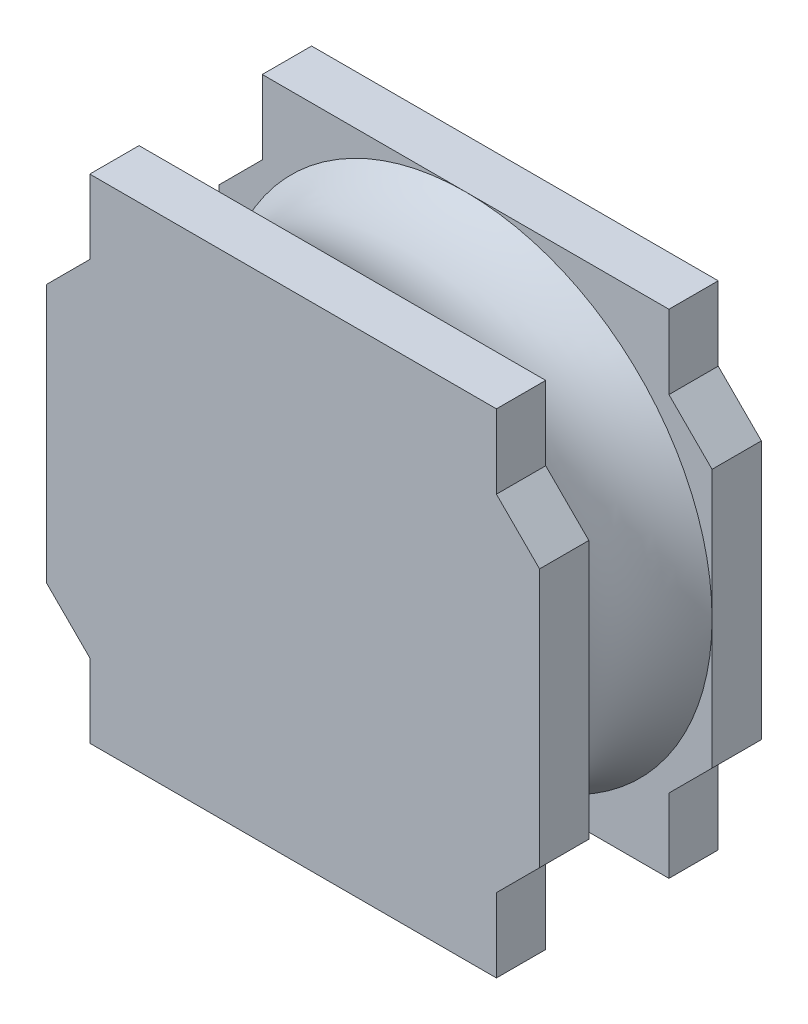
ISO-10303-21;
HEADER;
FILE_DESCRIPTION(('STEP AP214'),'2;1');
FILE_NAME('part.step','',(''),(''),'','','');
FILE_SCHEMA(('AUTOMOTIVE_DESIGN { 1 0 10303 214 1 1 1 1 }'));
ENDSEC;
DATA;
#1=APPLICATION_CONTEXT('core data for automotive mechanical design processes');
#2=APPLICATION_PROTOCOL_DEFINITION('international standard','automotive_design',2000,#1);
#3=PRODUCT_CONTEXT('',#1,'mechanical');
#4=PRODUCT('Part','Part','',(#3));
#5=PRODUCT_RELATED_PRODUCT_CATEGORY('part','',(#4));
#6=PRODUCT_DEFINITION_FORMATION('','',#4);
#7=PRODUCT_DEFINITION_CONTEXT('part definition',#1,'design');
#8=PRODUCT_DEFINITION('design','',#6,#7);
#9=PRODUCT_DEFINITION_SHAPE('','',#8);
#10=(LENGTH_UNIT() NAMED_UNIT(*) SI_UNIT(.MILLI.,.METRE.));
#11=(NAMED_UNIT(*) PLANE_ANGLE_UNIT() SI_UNIT($,.RADIAN.));
#12=(NAMED_UNIT(*) SI_UNIT($,.STERADIAN.) SOLID_ANGLE_UNIT());
#13=UNCERTAINTY_MEASURE_WITH_UNIT(LENGTH_MEASURE(1.E-05),#10,'distance_accuracy_value','');
#14=(GEOMETRIC_REPRESENTATION_CONTEXT(3) GLOBAL_UNCERTAINTY_ASSIGNED_CONTEXT((#13)) GLOBAL_UNIT_ASSIGNED_CONTEXT((#10,
#11,#12)) REPRESENTATION_CONTEXT('',''));
#15=CARTESIAN_POINT('',(0.,0.,0.));
#16=DIRECTION('',(0.,0.,1.));
#17=DIRECTION('',(1.,0.,0.));
#18=AXIS2_PLACEMENT_3D('',#15,#16,#17);
#19=CARTESIAN_POINT('',(-1.65,1.4,1.8));
#20=DIRECTION('',(0.707106781186547,-0.707106781186548,0.));
#21=DIRECTION('',(0.707106781186548,0.707106781186547,0.));
#22=AXIS2_PLACEMENT_3D('',#19,#20,#21);
#23=PLANE('',#22);
#24=DIRECTION('',(-0.707106781186548,-0.707106781186547,0.));
#25=VECTOR('',#24,1.);
#26=CARTESIAN_POINT('',(-1.65,1.4,0.400000000000001));
#27=LINE('',#26,#25);
#28=CARTESIAN_POINT('',(-1.65,1.4,0.400000000000001));
#29=VERTEX_POINT('',#28);
#30=CARTESIAN_POINT('',(-2.,1.05,0.400000000000001));
#31=VERTEX_POINT('',#30);
#32=EDGE_CURVE('E293',#29,#31,#27,.T.);
#33=ORIENTED_EDGE('',*,*,#32,.F.);
#34=DIRECTION('',(0.,0.,-1.));
#35=VECTOR('',#34,1.);
#36=CARTESIAN_POINT('',(-1.65,1.4,1.8));
#37=LINE('',#36,#35);
#38=CARTESIAN_POINT('',(-1.65,1.4,0.));
#39=VERTEX_POINT('',#38);
#40=EDGE_CURVE('E322',#29,#39,#37,.T.);
#41=ORIENTED_EDGE('',*,*,#40,.T.);
#42=DIRECTION('',(-0.707106781186548,-0.707106781186547,0.));
#43=VECTOR('',#42,1.);
#44=CARTESIAN_POINT('',(-1.65,1.4,0.));
#45=LINE('',#44,#43);
#46=CARTESIAN_POINT('',(-2.,1.05,0.));
#47=VERTEX_POINT('',#46);
#48=EDGE_CURVE('E295',#39,#47,#45,.T.);
#49=ORIENTED_EDGE('',*,*,#48,.T.);
#50=DIRECTION('',(0.,0.,-1.));
#51=VECTOR('',#50,1.);
#52=CARTESIAN_POINT('',(-2.,1.05,1.8));
#53=LINE('',#52,#51);
#54=EDGE_CURVE('E399',#31,#47,#53,.T.);
#55=ORIENTED_EDGE('',*,*,#54,.F.);
#56=EDGE_LOOP('',(#33,#41,#49,#55));
#57=FACE_BOUND('',#56,.T.);
#58=ADVANCED_FACE('F35',(#57),#23,.F.);
#59=CARTESIAN_POINT('',(-2.,1.05,1.8));
#60=DIRECTION('',(1.,0.,0.));
#61=DIRECTION('',(0.,0.,-1.));
#62=AXIS2_PLACEMENT_3D('',#59,#60,#61);
#63=PLANE('',#62);
#64=DIRECTION('',(0.,-1.,0.));
#65=VECTOR('',#64,1.);
#66=CARTESIAN_POINT('',(-2.,1.05,0.400000000000001));
#67=LINE('',#66,#65);
#68=CARTESIAN_POINT('',(-2.,0.,0.4));
#69=VERTEX_POINT('',#68);
#70=EDGE_CURVE('E292',#31,#69,#67,.T.);
#71=ORIENTED_EDGE('',*,*,#70,.F.);
#72=ORIENTED_EDGE('',*,*,#54,.T.);
#73=DIRECTION('',(0.,-1.,0.));
#74=VECTOR('',#73,1.);
#75=CARTESIAN_POINT('',(-2.,1.05,0.));
#76=LINE('',#75,#74);
#77=CARTESIAN_POINT('',(-2.,-1.05,0.));
#78=VERTEX_POINT('',#77);
#79=EDGE_CURVE('E325',#47,#78,#76,.T.);
#80=ORIENTED_EDGE('',*,*,#79,.T.);
#81=DIRECTION('',(0.,0.,-1.));
#82=VECTOR('',#81,1.);
#83=CARTESIAN_POINT('',(-2.,-1.05,1.8));
#84=LINE('',#83,#82);
#85=CARTESIAN_POINT('',(-2.,-1.05,0.400000000000001));
#86=VERTEX_POINT('',#85);
#87=EDGE_CURVE('E396',#86,#78,#84,.T.);
#88=ORIENTED_EDGE('',*,*,#87,.F.);
#89=EDGE_CURVE('E290',#69,#86,#67,.T.);
#90=ORIENTED_EDGE('',*,*,#89,.F.);
#91=EDGE_LOOP('',(#71,#72,#80,#88,#90));
#92=FACE_BOUND('',#91,.T.);
#93=ADVANCED_FACE('F491',(#92),#63,.F.);
#94=CARTESIAN_POINT('',(-1.65,-1.4,1.8));
#95=DIRECTION('',(0.707106781186547,0.707106781186548,0.));
#96=DIRECTION('',(-0.707106781186548,0.707106781186547,0.));
#97=AXIS2_PLACEMENT_3D('',#94,#95,#96);
#98=PLANE('',#97);
#99=DIRECTION('',(0.707106781186548,-0.707106781186547,0.));
#100=VECTOR('',#99,1.);
#101=CARTESIAN_POINT('',(-1.65,-1.4,0.400000000000001));
#102=LINE('',#101,#100);
#103=CARTESIAN_POINT('',(-1.65,-1.4,0.400000000000001));
#104=VERTEX_POINT('',#103);
#105=EDGE_CURVE('E288',#86,#104,#102,.T.);
#106=ORIENTED_EDGE('',*,*,#105,.F.);
#107=ORIENTED_EDGE('',*,*,#87,.T.);
#108=DIRECTION('',(0.707106781186548,-0.707106781186547,0.));
#109=VECTOR('',#108,1.);
#110=CARTESIAN_POINT('',(-1.65,-1.4,0.));
#111=LINE('',#110,#109);
#112=CARTESIAN_POINT('',(-1.65,-1.4,0.));
#113=VERTEX_POINT('',#112);
#114=EDGE_CURVE('E328',#78,#113,#111,.T.);
#115=ORIENTED_EDGE('',*,*,#114,.T.);
#116=DIRECTION('',(0.,0.,-1.));
#117=VECTOR('',#116,1.);
#118=CARTESIAN_POINT('',(-1.65,-1.4,1.8));
#119=LINE('',#118,#117);
#120=EDGE_CURVE('E392',#104,#113,#119,.T.);
#121=ORIENTED_EDGE('',*,*,#120,.F.);
#122=EDGE_LOOP('',(#106,#107,#115,#121));
#123=FACE_BOUND('',#122,.T.);
#124=ADVANCED_FACE('F487',(#123),#98,.F.);
#125=CARTESIAN_POINT('',(-1.65,-2.,1.8));
#126=DIRECTION('',(1.,0.,0.));
#127=DIRECTION('',(0.,1.,0.));
#128=AXIS2_PLACEMENT_3D('',#125,#126,#127);
#129=PLANE('',#128);
#130=DIRECTION('',(0.,-1.,0.));
#131=VECTOR('',#130,1.);
#132=CARTESIAN_POINT('',(-1.65,-2.,0.400000000000001));
#133=LINE('',#132,#131);
#134=CARTESIAN_POINT('',(-1.65,-2.,0.400000000000001));
#135=VERTEX_POINT('',#134);
#136=EDGE_CURVE('E286',#104,#135,#133,.T.);
#137=ORIENTED_EDGE('',*,*,#136,.F.);
#138=ORIENTED_EDGE('',*,*,#120,.T.);
#139=DIRECTION('',(0.,-1.,0.));
#140=VECTOR('',#139,1.);
#141=CARTESIAN_POINT('',(-1.65,-2.,0.));
#142=LINE('',#141,#140);
#143=CARTESIAN_POINT('',(-1.65,-2.,0.));
#144=VERTEX_POINT('',#143);
#145=EDGE_CURVE('E331',#113,#144,#142,.T.);
#146=ORIENTED_EDGE('',*,*,#145,.T.);
#147=DIRECTION('',(0.,0.,-1.));
#148=VECTOR('',#147,1.);
#149=CARTESIAN_POINT('',(-1.65,-2.,1.8));
#150=LINE('',#149,#148);
#151=EDGE_CURVE('E388',#135,#144,#150,.T.);
#152=ORIENTED_EDGE('',*,*,#151,.F.);
#153=EDGE_LOOP('',(#137,#138,#146,#152));
#154=FACE_BOUND('',#153,.T.);
#155=ADVANCED_FACE('F482',(#154),#129,.F.);
#156=CARTESIAN_POINT('',(-1.65,-2.,1.8));
#157=DIRECTION('',(0.,1.,0.));
#158=DIRECTION('',(0.,0.,1.));
#159=AXIS2_PLACEMENT_3D('',#156,#157,#158);
#160=PLANE('',#159);
#161=DIRECTION('',(1.,0.,0.));
#162=VECTOR('',#161,1.);
#163=CARTESIAN_POINT('',(-1.65,-2.,0.400000000000001));
#164=LINE('',#163,#162);
#165=CARTESIAN_POINT('',(0.,-2.,0.4));
#166=VERTEX_POINT('',#165);
#167=EDGE_CURVE('E285',#135,#166,#164,.T.);
#168=ORIENTED_EDGE('',*,*,#167,.F.);
#169=ORIENTED_EDGE('',*,*,#151,.T.);
#170=DIRECTION('',(1.,0.,0.));
#171=VECTOR('',#170,1.);
#172=CARTESIAN_POINT('',(-1.65,-2.,0.));
#173=LINE('',#172,#171);
#174=CARTESIAN_POINT('',(1.65,-2.,0.));
#175=VERTEX_POINT('',#174);
#176=EDGE_CURVE('E334',#144,#175,#173,.T.);
#177=ORIENTED_EDGE('',*,*,#176,.T.);
#178=DIRECTION('',(0.,0.,-1.));
#179=VECTOR('',#178,1.);
#180=CARTESIAN_POINT('',(1.65,-2.,1.8));
#181=LINE('',#180,#179);
#182=CARTESIAN_POINT('',(1.65,-2.,0.4));
#183=VERTEX_POINT('',#182);
#184=EDGE_CURVE('E384',#183,#175,#181,.T.);
#185=ORIENTED_EDGE('',*,*,#184,.F.);
#186=EDGE_CURVE('E283',#166,#183,#164,.T.);
#187=ORIENTED_EDGE('',*,*,#186,.F.);
#188=EDGE_LOOP('',(#168,#169,#177,#185,#187));
#189=FACE_BOUND('',#188,.T.);
#190=ADVANCED_FACE('F477',(#189),#160,.F.);
#191=CARTESIAN_POINT('',(1.65,-2.,1.8));
#192=DIRECTION('',(-1.,0.,0.));
#193=DIRECTION('',(0.,-1.,0.));
#194=AXIS2_PLACEMENT_3D('',#191,#192,#193);
#195=PLANE('',#194);
#196=DIRECTION('',(0.,1.,0.));
#197=VECTOR('',#196,1.);
#198=CARTESIAN_POINT('',(1.65,-2.,0.4));
#199=LINE('',#198,#197);
#200=CARTESIAN_POINT('',(1.65,-1.4,0.4));
#201=VERTEX_POINT('',#200);
#202=EDGE_CURVE('E281',#183,#201,#199,.T.);
#203=ORIENTED_EDGE('',*,*,#202,.F.);
#204=ORIENTED_EDGE('',*,*,#184,.T.);
#205=DIRECTION('',(0.,1.,0.));
#206=VECTOR('',#205,1.);
#207=CARTESIAN_POINT('',(1.65,-2.,0.));
#208=LINE('',#207,#206);
#209=CARTESIAN_POINT('',(1.65,-1.4,0.));
#210=VERTEX_POINT('',#209);
#211=EDGE_CURVE('E337',#175,#210,#208,.T.);
#212=ORIENTED_EDGE('',*,*,#211,.T.);
#213=DIRECTION('',(0.,0.,-1.));
#214=VECTOR('',#213,1.);
#215=CARTESIAN_POINT('',(1.65,-1.4,1.8));
#216=LINE('',#215,#214);
#217=EDGE_CURVE('E380',#201,#210,#216,.T.);
#218=ORIENTED_EDGE('',*,*,#217,.F.);
#219=EDGE_LOOP('',(#203,#204,#212,#218));
#220=FACE_BOUND('',#219,.T.);
#221=ADVANCED_FACE('F472',(#220),#195,.F.);
#222=CARTESIAN_POINT('',(1.65,-1.4,1.8));
#223=DIRECTION('',(-0.707106781186547,0.707106781186548,0.));
#224=DIRECTION('',(-0.707106781186548,-0.707106781186547,0.));
#225=AXIS2_PLACEMENT_3D('',#222,#223,#224);
#226=PLANE('',#225);
#227=DIRECTION('',(0.707106781186548,0.707106781186547,0.));
#228=VECTOR('',#227,1.);
#229=CARTESIAN_POINT('',(1.65,-1.4,0.4));
#230=LINE('',#229,#228);
#231=CARTESIAN_POINT('',(2.,-1.05,0.4));
#232=VERTEX_POINT('',#231);
#233=EDGE_CURVE('E279',#201,#232,#230,.T.);
#234=ORIENTED_EDGE('',*,*,#233,.F.);
#235=ORIENTED_EDGE('',*,*,#217,.T.);
#236=DIRECTION('',(0.707106781186548,0.707106781186547,0.));
#237=VECTOR('',#236,1.);
#238=CARTESIAN_POINT('',(1.65,-1.4,0.));
#239=LINE('',#238,#237);
#240=CARTESIAN_POINT('',(2.,-1.05,0.));
#241=VERTEX_POINT('',#240);
#242=EDGE_CURVE('E340',#210,#241,#239,.T.);
#243=ORIENTED_EDGE('',*,*,#242,.T.);
#244=DIRECTION('',(0.,0.,-1.));
#245=VECTOR('',#244,1.);
#246=CARTESIAN_POINT('',(2.,-1.05,1.8));
#247=LINE('',#246,#245);
#248=EDGE_CURVE('E376',#232,#241,#247,.T.);
#249=ORIENTED_EDGE('',*,*,#248,.F.);
#250=EDGE_LOOP('',(#234,#235,#243,#249));
#251=FACE_BOUND('',#250,.T.);
#252=ADVANCED_FACE('F467',(#251),#226,.F.);
#253=CARTESIAN_POINT('',(2.,1.05,1.8));
#254=DIRECTION('',(-1.,0.,0.));
#255=DIRECTION('',(0.,0.,1.));
#256=AXIS2_PLACEMENT_3D('',#253,#254,#255);
#257=PLANE('',#256);
#258=DIRECTION('',(0.,1.,0.));
#259=VECTOR('',#258,1.);
#260=CARTESIAN_POINT('',(2.,1.05,0.4));
#261=LINE('',#260,#259);
#262=CARTESIAN_POINT('',(2.,0.,0.4));
#263=VERTEX_POINT('',#262);
#264=EDGE_CURVE('E278',#232,#263,#261,.T.);
#265=ORIENTED_EDGE('',*,*,#264,.F.);
#266=ORIENTED_EDGE('',*,*,#248,.T.);
#267=DIRECTION('',(0.,1.,0.));
#268=VECTOR('',#267,1.);
#269=CARTESIAN_POINT('',(2.,1.05,0.));
#270=LINE('',#269,#268);
#271=CARTESIAN_POINT('',(2.,1.05,0.));
#272=VERTEX_POINT('',#271);
#273=EDGE_CURVE('E343',#241,#272,#270,.T.);
#274=ORIENTED_EDGE('',*,*,#273,.T.);
#275=DIRECTION('',(0.,0.,-1.));
#276=VECTOR('',#275,1.);
#277=CARTESIAN_POINT('',(2.,1.05,1.8));
#278=LINE('',#277,#276);
#279=CARTESIAN_POINT('',(2.,1.05,0.4));
#280=VERTEX_POINT('',#279);
#281=EDGE_CURVE('E372',#280,#272,#278,.T.);
#282=ORIENTED_EDGE('',*,*,#281,.F.);
#283=EDGE_CURVE('E276',#263,#280,#261,.T.);
#284=ORIENTED_EDGE('',*,*,#283,.F.);
#285=EDGE_LOOP('',(#265,#266,#274,#282,#284));
#286=FACE_BOUND('',#285,.T.);
#287=ADVANCED_FACE('F462',(#286),#257,.F.);
#288=CARTESIAN_POINT('',(1.65,1.4,1.8));
#289=DIRECTION('',(-0.707106781186547,-0.707106781186548,0.));
#290=DIRECTION('',(0.707106781186548,-0.707106781186547,0.));
#291=AXIS2_PLACEMENT_3D('',#288,#289,#290);
#292=PLANE('',#291);
#293=DIRECTION('',(-0.707106781186548,0.707106781186547,0.));
#294=VECTOR('',#293,1.);
#295=CARTESIAN_POINT('',(1.65,1.4,0.4));
#296=LINE('',#295,#294);
#297=CARTESIAN_POINT('',(1.65,1.4,0.4));
#298=VERTEX_POINT('',#297);
#299=EDGE_CURVE('E274',#280,#298,#296,.T.);
#300=ORIENTED_EDGE('',*,*,#299,.F.);
#301=ORIENTED_EDGE('',*,*,#281,.T.);
#302=DIRECTION('',(-0.707106781186548,0.707106781186547,0.));
#303=VECTOR('',#302,1.);
#304=CARTESIAN_POINT('',(1.65,1.4,0.));
#305=LINE('',#304,#303);
#306=CARTESIAN_POINT('',(1.65,1.4,0.));
#307=VERTEX_POINT('',#306);
#308=EDGE_CURVE('E346',#272,#307,#305,.T.);
#309=ORIENTED_EDGE('',*,*,#308,.T.);
#310=DIRECTION('',(0.,0.,-1.));
#311=VECTOR('',#310,1.);
#312=CARTESIAN_POINT('',(1.65,1.4,1.8));
#313=LINE('',#312,#311);
#314=EDGE_CURVE('E368',#298,#307,#313,.T.);
#315=ORIENTED_EDGE('',*,*,#314,.F.);
#316=EDGE_LOOP('',(#300,#301,#309,#315));
#317=FACE_BOUND('',#316,.T.);
#318=ADVANCED_FACE('F458',(#317),#292,.F.);
#319=CARTESIAN_POINT('',(1.65,2.,1.8));
#320=DIRECTION('',(-1.,0.,0.));
#321=DIRECTION('',(0.,-1.,0.));
#322=AXIS2_PLACEMENT_3D('',#319,#320,#321);
#323=PLANE('',#322);
#324=DIRECTION('',(0.,1.,0.));
#325=VECTOR('',#324,1.);
#326=CARTESIAN_POINT('',(1.65,2.,0.4));
#327=LINE('',#326,#325);
#328=CARTESIAN_POINT('',(1.65,2.,0.4));
#329=VERTEX_POINT('',#328);
#330=EDGE_CURVE('E272',#298,#329,#327,.T.);
#331=ORIENTED_EDGE('',*,*,#330,.F.);
#332=ORIENTED_EDGE('',*,*,#314,.T.);
#333=DIRECTION('',(0.,1.,0.));
#334=VECTOR('',#333,1.);
#335=CARTESIAN_POINT('',(1.65,2.,0.));
#336=LINE('',#335,#334);
#337=CARTESIAN_POINT('',(1.65,2.,0.));
#338=VERTEX_POINT('',#337);
#339=EDGE_CURVE('E349',#307,#338,#336,.T.);
#340=ORIENTED_EDGE('',*,*,#339,.T.);
#341=DIRECTION('',(0.,0.,-1.));
#342=VECTOR('',#341,1.);
#343=CARTESIAN_POINT('',(1.65,2.,1.8));
#344=LINE('',#343,#342);
#345=EDGE_CURVE('E364',#329,#338,#344,.T.);
#346=ORIENTED_EDGE('',*,*,#345,.F.);
#347=EDGE_LOOP('',(#331,#332,#340,#346));
#348=FACE_BOUND('',#347,.T.);
#349=ADVANCED_FACE('F454',(#348),#323,.F.);
#350=CARTESIAN_POINT('',(-1.65,2.,1.8));
#351=DIRECTION('',(0.,-1.,0.));
#352=DIRECTION('',(0.,0.,-1.));
#353=AXIS2_PLACEMENT_3D('',#350,#351,#352);
#354=PLANE('',#353);
#355=DIRECTION('',(-1.,0.,0.));
#356=VECTOR('',#355,1.);
#357=CARTESIAN_POINT('',(-1.65,2.,0.400000000000001));
#358=LINE('',#357,#356);
#359=CARTESIAN_POINT('',(0.,2.,0.4));
#360=VERTEX_POINT('',#359);
#361=EDGE_CURVE('E271',#329,#360,#358,.T.);
#362=ORIENTED_EDGE('',*,*,#361,.F.);
#363=ORIENTED_EDGE('',*,*,#345,.T.);
#364=DIRECTION('',(-1.,0.,0.));
#365=VECTOR('',#364,1.);
#366=CARTESIAN_POINT('',(-1.65,2.,0.));
#367=LINE('',#366,#365);
#368=CARTESIAN_POINT('',(-1.65,2.,0.));
#369=VERTEX_POINT('',#368);
#370=EDGE_CURVE('E352',#338,#369,#367,.T.);
#371=ORIENTED_EDGE('',*,*,#370,.T.);
#372=DIRECTION('',(0.,0.,-1.));
#373=VECTOR('',#372,1.);
#374=CARTESIAN_POINT('',(-1.65,2.,1.8));
#375=LINE('',#374,#373);
#376=CARTESIAN_POINT('',(-1.65,2.,0.400000000000001));
#377=VERTEX_POINT('',#376);
#378=EDGE_CURVE('E360',#377,#369,#375,.T.);
#379=ORIENTED_EDGE('',*,*,#378,.F.);
#380=EDGE_CURVE('E48',#360,#377,#358,.T.);
#381=ORIENTED_EDGE('',*,*,#380,.F.);
#382=EDGE_LOOP('',(#362,#363,#371,#379,#381));
#383=FACE_BOUND('',#382,.T.);
#384=ADVANCED_FACE('F450',(#383),#354,.F.);
#385=CARTESIAN_POINT('',(-1.65,2.,1.8));
#386=DIRECTION('',(1.,0.,0.));
#387=DIRECTION('',(0.,0.,-1.));
#388=AXIS2_PLACEMENT_3D('',#385,#386,#387);
#389=PLANE('',#388);
#390=DIRECTION('',(0.,-1.,0.));
#391=VECTOR('',#390,1.);
#392=CARTESIAN_POINT('',(-1.65,2.,0.400000000000001));
#393=LINE('',#392,#391);
#394=EDGE_CURVE('E11',#377,#29,#393,.T.);
#395=ORIENTED_EDGE('',*,*,#394,.F.);
#396=ORIENTED_EDGE('',*,*,#378,.T.);
#397=DIRECTION('',(0.,-1.,0.));
#398=VECTOR('',#397,1.);
#399=CARTESIAN_POINT('',(-1.65,2.,0.));
#400=LINE('',#399,#398);
#401=EDGE_CURVE('E300',#369,#39,#400,.T.);
#402=ORIENTED_EDGE('',*,*,#401,.T.);
#403=ORIENTED_EDGE('',*,*,#40,.F.);
#404=EDGE_LOOP('',(#395,#396,#402,#403));
#405=FACE_BOUND('',#404,.T.);
#406=ADVANCED_FACE('F446',(#405),#389,.F.);
#407=CARTESIAN_POINT('',(0.,0.,0.));
#408=DIRECTION('',(0.,0.,-1.));
#409=DIRECTION('',(-1.,0.,0.));
#410=AXIS2_PLACEMENT_3D('',#407,#408,#409);
#411=PLANE('',#410);
#412=ORIENTED_EDGE('',*,*,#48,.F.);
#413=ORIENTED_EDGE('',*,*,#401,.F.);
#414=ORIENTED_EDGE('',*,*,#370,.F.);
#415=ORIENTED_EDGE('',*,*,#339,.F.);
#416=ORIENTED_EDGE('',*,*,#308,.F.);
#417=ORIENTED_EDGE('',*,*,#273,.F.);
#418=ORIENTED_EDGE('',*,*,#242,.F.);
#419=ORIENTED_EDGE('',*,*,#211,.F.);
#420=ORIENTED_EDGE('',*,*,#176,.F.);
#421=ORIENTED_EDGE('',*,*,#145,.F.);
#422=ORIENTED_EDGE('',*,*,#114,.F.);
#423=ORIENTED_EDGE('',*,*,#79,.F.);
#424=EDGE_LOOP('',(#412,#413,#414,#415,#416,#417,#418,#419,#420,#421,#422,#423));
#425=FACE_BOUND('',#424,.T.);
#426=ADVANCED_FACE('F443',(#425),#411,.T.);
#427=CARTESIAN_POINT('',(2.,0.,0.4));
#428=DIRECTION('',(0.,0.,1.));
#429=DIRECTION('',(1.,0.,0.));
#430=AXIS2_PLACEMENT_3D('',#427,#428,#429);
#431=PLANE('',#430);
#432=ORIENTED_EDGE('',*,*,#32,.T.);
#433=ORIENTED_EDGE('',*,*,#70,.T.);
#434=CARTESIAN_POINT('',(0.,0.,0.4));
#435=DIRECTION('',(0.,0.,-1.));
#436=DIRECTION('',(-1.,0.,0.));
#437=AXIS2_PLACEMENT_3D('',#434,#435,#436);
#438=CIRCLE('',#437,2.);
#439=EDGE_CURVE('E408',#69,#360,#438,.T.);
#440=ORIENTED_EDGE('',*,*,#439,.T.);
#441=ORIENTED_EDGE('',*,*,#380,.T.);
#442=ORIENTED_EDGE('',*,*,#394,.T.);
#443=EDGE_LOOP('',(#432,#433,#440,#441,#442));
#444=FACE_BOUND('',#443,.T.);
#445=ADVANCED_FACE('F439',(#444),#431,.T.);
#446=ORIENTED_EDGE('',*,*,#89,.T.);
#447=ORIENTED_EDGE('',*,*,#105,.T.);
#448=ORIENTED_EDGE('',*,*,#136,.T.);
#449=ORIENTED_EDGE('',*,*,#167,.T.);
#450=EDGE_CURVE('E249',#166,#69,#438,.T.);
#451=ORIENTED_EDGE('',*,*,#450,.T.);
#452=EDGE_LOOP('',(#446,#447,#448,#449,#451));
#453=FACE_BOUND('',#452,.T.);
#454=ADVANCED_FACE('F643',(#453),#431,.T.);
#455=ORIENTED_EDGE('',*,*,#186,.T.);
#456=ORIENTED_EDGE('',*,*,#202,.T.);
#457=ORIENTED_EDGE('',*,*,#233,.T.);
#458=ORIENTED_EDGE('',*,*,#264,.T.);
#459=EDGE_CURVE('E787',#263,#166,#438,.T.);
#460=ORIENTED_EDGE('',*,*,#459,.T.);
#461=EDGE_LOOP('',(#455,#456,#457,#458,#460));
#462=FACE_BOUND('',#461,.T.);
#463=ADVANCED_FACE('F548',(#462),#431,.T.);
#464=ORIENTED_EDGE('',*,*,#283,.T.);
#465=ORIENTED_EDGE('',*,*,#299,.T.);
#466=ORIENTED_EDGE('',*,*,#330,.T.);
#467=ORIENTED_EDGE('',*,*,#361,.T.);
#468=EDGE_CURVE('E426',#360,#263,#438,.T.);
#469=ORIENTED_EDGE('',*,*,#468,.T.);
#470=EDGE_LOOP('',(#464,#465,#466,#467,#469));
#471=FACE_BOUND('',#470,.T.);
#472=ADVANCED_FACE('F544',(#471),#431,.T.);
#473=CARTESIAN_POINT('',(3.5,0.,1.4));
#474=DIRECTION('',(0.,0.,-1.));
#475=DIRECTION('',(-1.,0.,0.));
#476=AXIS2_PLACEMENT_3D('',#473,#474,#475);
#477=PLANE('',#476);
#478=DIRECTION('',(0.,1.,0.));
#479=VECTOR('',#478,1.);
#480=CARTESIAN_POINT('',(-1.65,-2.,1.4));
#481=LINE('',#480,#479);
#482=CARTESIAN_POINT('',(-1.65,-2.,1.4));
#483=VERTEX_POINT('',#482);
#484=CARTESIAN_POINT('',(-1.65,-1.4,1.4));
#485=VERTEX_POINT('',#484);
#486=EDGE_CURVE('E268',#483,#485,#481,.T.);
#487=ORIENTED_EDGE('',*,*,#486,.T.);
#488=DIRECTION('',(-0.707106781186548,0.707106781186547,0.));
#489=VECTOR('',#488,1.);
#490=CARTESIAN_POINT('',(-1.65,-1.4,1.4));
#491=LINE('',#490,#489);
#492=CARTESIAN_POINT('',(-2.,-1.05,1.4));
#493=VERTEX_POINT('',#492);
#494=EDGE_CURVE('E225',#485,#493,#491,.T.);
#495=ORIENTED_EDGE('',*,*,#494,.T.);
#496=DIRECTION('',(0.,1.,0.));
#497=VECTOR('',#496,1.);
#498=CARTESIAN_POINT('',(-2.,1.05,1.4));
#499=LINE('',#498,#497);
#500=CARTESIAN_POINT('',(-2.,0.,1.4));
#501=VERTEX_POINT('',#500);
#502=EDGE_CURVE('E219',#493,#501,#499,.T.);
#503=ORIENTED_EDGE('',*,*,#502,.T.);
#504=CARTESIAN_POINT('',(0.,0.,1.4));
#505=DIRECTION('',(0.,0.,-1.));
#506=DIRECTION('',(-1.,0.,0.));
#507=AXIS2_PLACEMENT_3D('',#504,#505,#506);
#508=CIRCLE('',#507,2.);
#509=CARTESIAN_POINT('',(0.,-2.,1.4));
#510=VERTEX_POINT('',#509);
#511=EDGE_CURVE('E222',#510,#501,#508,.T.);
#512=ORIENTED_EDGE('',*,*,#511,.F.);
#513=DIRECTION('',(-1.,0.,0.));
#514=VECTOR('',#513,1.);
#515=CARTESIAN_POINT('',(-1.65,-2.,1.4));
#516=LINE('',#515,#514);
#517=EDGE_CURVE('E266',#510,#483,#516,.T.);
#518=ORIENTED_EDGE('',*,*,#517,.T.);
#519=EDGE_LOOP('',(#487,#495,#503,#512,#518));
#520=FACE_BOUND('',#519,.T.);
#521=ADVANCED_FACE('F221',(#520),#477,.T.);
#522=CARTESIAN_POINT('',(1.65,-2.,1.4));
#523=VERTEX_POINT('',#522);
#524=EDGE_CURVE('E264',#523,#510,#516,.T.);
#525=ORIENTED_EDGE('',*,*,#524,.T.);
#526=CARTESIAN_POINT('',(2.,0.,1.4));
#527=VERTEX_POINT('',#526);
#528=EDGE_CURVE('E242',#527,#510,#508,.T.);
#529=ORIENTED_EDGE('',*,*,#528,.F.);
#530=DIRECTION('',(0.,-1.,0.));
#531=VECTOR('',#530,1.);
#532=CARTESIAN_POINT('',(2.,1.05,1.4));
#533=LINE('',#532,#531);
#534=CARTESIAN_POINT('',(2.,-1.05,1.4));
#535=VERTEX_POINT('',#534);
#536=EDGE_CURVE('E230',#527,#535,#533,.T.);
#537=ORIENTED_EDGE('',*,*,#536,.T.);
#538=DIRECTION('',(-0.707106781186548,-0.707106781186547,0.));
#539=VECTOR('',#538,1.);
#540=CARTESIAN_POINT('',(1.65,-1.4,1.4));
#541=LINE('',#540,#539);
#542=CARTESIAN_POINT('',(1.65,-1.4,1.4));
#543=VERTEX_POINT('',#542);
#544=EDGE_CURVE('E260',#535,#543,#541,.T.);
#545=ORIENTED_EDGE('',*,*,#544,.T.);
#546=DIRECTION('',(0.,-1.,0.));
#547=VECTOR('',#546,1.);
#548=CARTESIAN_POINT('',(1.65,-2.,1.4));
#549=LINE('',#548,#547);
#550=EDGE_CURVE('E262',#543,#523,#549,.T.);
#551=ORIENTED_EDGE('',*,*,#550,.T.);
#552=EDGE_LOOP('',(#525,#529,#537,#545,#551));
#553=FACE_BOUND('',#552,.T.);
#554=ADVANCED_FACE('F538',(#553),#477,.T.);
#555=CARTESIAN_POINT('',(-2.,1.05,1.4));
#556=VERTEX_POINT('',#555);
#557=EDGE_CURVE('E231',#501,#556,#499,.T.);
#558=ORIENTED_EDGE('',*,*,#557,.T.);
#559=DIRECTION('',(0.707106781186548,0.707106781186547,0.));
#560=VECTOR('',#559,1.);
#561=CARTESIAN_POINT('',(-1.65,1.4,1.4));
#562=LINE('',#561,#560);
#563=CARTESIAN_POINT('',(-1.65,1.4,1.4));
#564=VERTEX_POINT('',#563);
#565=EDGE_CURVE('E56',#556,#564,#562,.T.);
#566=ORIENTED_EDGE('',*,*,#565,.T.);
#567=DIRECTION('',(0.,1.,0.));
#568=VECTOR('',#567,1.);
#569=CARTESIAN_POINT('',(-1.65,2.,1.4));
#570=LINE('',#569,#568);
#571=CARTESIAN_POINT('',(-1.65,2.,1.4));
#572=VERTEX_POINT('',#571);
#573=EDGE_CURVE('E42',#564,#572,#570,.T.);
#574=ORIENTED_EDGE('',*,*,#573,.T.);
#575=DIRECTION('',(1.,0.,0.));
#576=VECTOR('',#575,1.);
#577=CARTESIAN_POINT('',(-1.65,2.,1.4));
#578=LINE('',#577,#576);
#579=CARTESIAN_POINT('',(0.,2.,1.4));
#580=VERTEX_POINT('',#579);
#581=EDGE_CURVE('E247',#572,#580,#578,.T.);
#582=ORIENTED_EDGE('',*,*,#581,.T.);
#583=EDGE_CURVE('E239',#501,#580,#508,.T.);
#584=ORIENTED_EDGE('',*,*,#583,.F.);
#585=EDGE_LOOP('',(#558,#566,#574,#582,#584));
#586=FACE_BOUND('',#585,.T.);
#587=ADVANCED_FACE('F245',(#586),#477,.T.);
#588=CARTESIAN_POINT('',(2.,1.05,1.4));
#589=VERTEX_POINT('',#588);
#590=EDGE_CURVE('E255',#589,#527,#533,.T.);
#591=ORIENTED_EDGE('',*,*,#590,.T.);
#592=EDGE_CURVE('E250',#580,#527,#508,.T.);
#593=ORIENTED_EDGE('',*,*,#592,.F.);
#594=CARTESIAN_POINT('',(1.65,2.,1.4));
#595=VERTEX_POINT('',#594);
#596=EDGE_CURVE('E407',#580,#595,#578,.T.);
#597=ORIENTED_EDGE('',*,*,#596,.T.);
#598=DIRECTION('',(0.,-1.,0.));
#599=VECTOR('',#598,1.);
#600=CARTESIAN_POINT('',(1.65,2.,1.4));
#601=LINE('',#600,#599);
#602=CARTESIAN_POINT('',(1.65,1.4,1.4));
#603=VERTEX_POINT('',#602);
#604=EDGE_CURVE('E419',#595,#603,#601,.T.);
#605=ORIENTED_EDGE('',*,*,#604,.T.);
#606=DIRECTION('',(0.707106781186548,-0.707106781186547,0.));
#607=VECTOR('',#606,1.);
#608=CARTESIAN_POINT('',(1.65,1.4,1.4));
#609=LINE('',#608,#607);
#610=EDGE_CURVE('E256',#603,#589,#609,.T.);
#611=ORIENTED_EDGE('',*,*,#610,.T.);
#612=EDGE_LOOP('',(#591,#593,#597,#605,#611));
#613=FACE_BOUND('',#612,.T.);
#614=ADVANCED_FACE('F438',(#613),#477,.T.);
#615=CARTESIAN_POINT('',(2.,0.,0.4));
#616=CARTESIAN_POINT('',(1.7,0.,0.9));
#617=CARTESIAN_POINT('',(2.,0.,1.4));
#618=B_SPLINE_CURVE_WITH_KNOTS('',2,(#615,#616,#617),.UNSPECIFIED.,.F.,.F.,(3,3),(0.,1.),.UNSPECIFIED.);
#619=CARTESIAN_POINT('',(0.,0.,0.4));
#620=DIRECTION('',(0.,0.,-1.));
#621=AXIS1_PLACEMENT('',#619,#620);
#622=SURFACE_OF_REVOLUTION('',#618,#621);
#623=ORIENTED_EDGE('',*,*,#583,.T.);
#624=ORIENTED_EDGE('',*,*,#592,.T.);
#625=ORIENTED_EDGE('',*,*,#528,.T.);
#626=ORIENTED_EDGE('',*,*,#511,.T.);
#627=EDGE_LOOP('',(#623,#624,#625,#626));
#628=FACE_BOUND('',#627,.T.);
#629=ORIENTED_EDGE('',*,*,#439,.F.);
#630=ORIENTED_EDGE('',*,*,#450,.F.);
#631=ORIENTED_EDGE('',*,*,#459,.F.);
#632=ORIENTED_EDGE('',*,*,#468,.F.);
#633=EDGE_LOOP('',(#629,#630,#631,#632));
#634=FACE_BOUND('',#633,.T.);
#635=ADVANCED_FACE('F236',(#628,#634),#622,.F.);
#636=CARTESIAN_POINT('',(0.,0.,1.8));
#637=DIRECTION('',(0.,0.,-1.));
#638=DIRECTION('',(-1.,0.,0.));
#639=AXIS2_PLACEMENT_3D('',#636,#637,#638);
#640=PLANE('',#639);
#641=DIRECTION('',(-0.707106781186548,-0.707106781186547,0.));
#642=VECTOR('',#641,1.);
#643=CARTESIAN_POINT('',(-1.65,1.4,1.8));
#644=LINE('',#643,#642);
#645=CARTESIAN_POINT('',(-1.65,1.4,1.8));
#646=VERTEX_POINT('',#645);
#647=CARTESIAN_POINT('',(-2.,1.05,1.8));
#648=VERTEX_POINT('',#647);
#649=EDGE_CURVE('E296',#646,#648,#644,.T.);
#650=ORIENTED_EDGE('',*,*,#649,.T.);
#651=DIRECTION('',(0.,-1.,0.));
#652=VECTOR('',#651,1.);
#653=CARTESIAN_POINT('',(-2.,1.05,1.8));
#654=LINE('',#653,#652);
#655=CARTESIAN_POINT('',(-2.,-1.05,1.8));
#656=VERTEX_POINT('',#655);
#657=EDGE_CURVE('E299',#648,#656,#654,.T.);
#658=ORIENTED_EDGE('',*,*,#657,.T.);
#659=DIRECTION('',(0.707106781186548,-0.707106781186547,0.));
#660=VECTOR('',#659,1.);
#661=CARTESIAN_POINT('',(-1.65,-1.4,1.8));
#662=LINE('',#661,#660);
#663=CARTESIAN_POINT('',(-1.65,-1.4,1.8));
#664=VERTEX_POINT('',#663);
#665=EDGE_CURVE('E302',#656,#664,#662,.T.);
#666=ORIENTED_EDGE('',*,*,#665,.T.);
#667=DIRECTION('',(0.,-1.,0.));
#668=VECTOR('',#667,1.);
#669=CARTESIAN_POINT('',(-1.65,-2.,1.8));
#670=LINE('',#669,#668);
#671=CARTESIAN_POINT('',(-1.65,-2.,1.8));
#672=VERTEX_POINT('',#671);
#673=EDGE_CURVE('E304',#664,#672,#670,.T.);
#674=ORIENTED_EDGE('',*,*,#673,.T.);
#675=DIRECTION('',(1.,0.,0.));
#676=VECTOR('',#675,1.);
#677=CARTESIAN_POINT('',(-1.65,-2.,1.8));
#678=LINE('',#677,#676);
#679=CARTESIAN_POINT('',(1.65,-2.,1.8));
#680=VERTEX_POINT('',#679);
#681=EDGE_CURVE('E306',#672,#680,#678,.T.);
#682=ORIENTED_EDGE('',*,*,#681,.T.);
#683=DIRECTION('',(0.,1.,0.));
#684=VECTOR('',#683,1.);
#685=CARTESIAN_POINT('',(1.65,-2.,1.8));
#686=LINE('',#685,#684);
#687=CARTESIAN_POINT('',(1.65,-1.4,1.8));
#688=VERTEX_POINT('',#687);
#689=EDGE_CURVE('E308',#680,#688,#686,.T.);
#690=ORIENTED_EDGE('',*,*,#689,.T.);
#691=DIRECTION('',(0.707106781186548,0.707106781186547,0.));
#692=VECTOR('',#691,1.);
#693=CARTESIAN_POINT('',(1.65,-1.4,1.8));
#694=LINE('',#693,#692);
#695=CARTESIAN_POINT('',(2.,-1.05,1.8));
#696=VERTEX_POINT('',#695);
#697=EDGE_CURVE('E310',#688,#696,#694,.T.);
#698=ORIENTED_EDGE('',*,*,#697,.T.);
#699=DIRECTION('',(0.,1.,0.));
#700=VECTOR('',#699,1.);
#701=CARTESIAN_POINT('',(2.,1.05,1.8));
#702=LINE('',#701,#700);
#703=CARTESIAN_POINT('',(2.,1.05,1.8));
#704=VERTEX_POINT('',#703);
#705=EDGE_CURVE('E312',#696,#704,#702,.T.);
#706=ORIENTED_EDGE('',*,*,#705,.T.);
#707=DIRECTION('',(-0.707106781186548,0.707106781186547,0.));
#708=VECTOR('',#707,1.);
#709=CARTESIAN_POINT('',(1.65,1.4,1.8));
#710=LINE('',#709,#708);
#711=CARTESIAN_POINT('',(1.65,1.4,1.8));
#712=VERTEX_POINT('',#711);
#713=EDGE_CURVE('E314',#704,#712,#710,.T.);
#714=ORIENTED_EDGE('',*,*,#713,.T.);
#715=DIRECTION('',(0.,1.,0.));
#716=VECTOR('',#715,1.);
#717=CARTESIAN_POINT('',(1.65,2.,1.8));
#718=LINE('',#717,#716);
#719=CARTESIAN_POINT('',(1.65,2.,1.8));
#720=VERTEX_POINT('',#719);
#721=EDGE_CURVE('E316',#712,#720,#718,.T.);
#722=ORIENTED_EDGE('',*,*,#721,.T.);
#723=DIRECTION('',(-1.,0.,0.));
#724=VECTOR('',#723,1.);
#725=CARTESIAN_POINT('',(-1.65,2.,1.8));
#726=LINE('',#725,#724);
#727=CARTESIAN_POINT('',(-1.65,2.,1.8));
#728=VERTEX_POINT('',#727);
#729=EDGE_CURVE('E318',#720,#728,#726,.T.);
#730=ORIENTED_EDGE('',*,*,#729,.T.);
#731=DIRECTION('',(0.,-1.,0.));
#732=VECTOR('',#731,1.);
#733=CARTESIAN_POINT('',(-1.65,2.,1.8));
#734=LINE('',#733,#732);
#735=EDGE_CURVE('E320',#728,#646,#734,.T.);
#736=ORIENTED_EDGE('',*,*,#735,.T.);
#737=EDGE_LOOP('',(#650,#658,#666,#674,#682,#690,#698,#706,#714,#722,#730,#736));
#738=FACE_BOUND('',#737,.T.);
#739=ADVANCED_FACE('F413',(#738),#640,.F.);
#740=ORIENTED_EDGE('',*,*,#573,.F.);
#741=EDGE_CURVE('E357',#646,#564,#37,.T.);
#742=ORIENTED_EDGE('',*,*,#741,.F.);
#743=ORIENTED_EDGE('',*,*,#735,.F.);
#744=EDGE_CURVE('E361',#728,#572,#375,.T.);
#745=ORIENTED_EDGE('',*,*,#744,.T.);
#746=EDGE_LOOP('',(#740,#742,#743,#745));
#747=FACE_BOUND('',#746,.T.);
#748=ADVANCED_FACE('F410',(#747),#389,.F.);
#749=ORIENTED_EDGE('',*,*,#581,.F.);
#750=ORIENTED_EDGE('',*,*,#744,.F.);
#751=ORIENTED_EDGE('',*,*,#729,.F.);
#752=EDGE_CURVE('E365',#720,#595,#344,.T.);
#753=ORIENTED_EDGE('',*,*,#752,.T.);
#754=ORIENTED_EDGE('',*,*,#596,.F.);
#755=EDGE_LOOP('',(#749,#750,#751,#753,#754));
#756=FACE_BOUND('',#755,.T.);
#757=ADVANCED_FACE('F404',(#756),#354,.F.);
#758=ORIENTED_EDGE('',*,*,#604,.F.);
#759=ORIENTED_EDGE('',*,*,#752,.F.);
#760=ORIENTED_EDGE('',*,*,#721,.F.);
#761=EDGE_CURVE('E369',#712,#603,#313,.T.);
#762=ORIENTED_EDGE('',*,*,#761,.T.);
#763=EDGE_LOOP('',(#758,#759,#760,#762));
#764=FACE_BOUND('',#763,.T.);
#765=ADVANCED_FACE('F418',(#764),#323,.F.);
#766=ORIENTED_EDGE('',*,*,#610,.F.);
#767=ORIENTED_EDGE('',*,*,#761,.F.);
#768=ORIENTED_EDGE('',*,*,#713,.F.);
#769=EDGE_CURVE('E373',#704,#589,#278,.T.);
#770=ORIENTED_EDGE('',*,*,#769,.T.);
#771=EDGE_LOOP('',(#766,#767,#768,#770));
#772=FACE_BOUND('',#771,.T.);
#773=ADVANCED_FACE('F464',(#772),#292,.F.);
#774=ORIENTED_EDGE('',*,*,#590,.F.);
#775=ORIENTED_EDGE('',*,*,#769,.F.);
#776=ORIENTED_EDGE('',*,*,#705,.F.);
#777=EDGE_CURVE('E377',#696,#535,#247,.T.);
#778=ORIENTED_EDGE('',*,*,#777,.T.);
#779=ORIENTED_EDGE('',*,*,#536,.F.);
#780=EDGE_LOOP('',(#774,#775,#776,#778,#779));
#781=FACE_BOUND('',#780,.T.);
#782=ADVANCED_FACE('F469',(#781),#257,.F.);
#783=ORIENTED_EDGE('',*,*,#544,.F.);
#784=ORIENTED_EDGE('',*,*,#777,.F.);
#785=ORIENTED_EDGE('',*,*,#697,.F.);
#786=EDGE_CURVE('E381',#688,#543,#216,.T.);
#787=ORIENTED_EDGE('',*,*,#786,.T.);
#788=EDGE_LOOP('',(#783,#784,#785,#787));
#789=FACE_BOUND('',#788,.T.);
#790=ADVANCED_FACE('F474',(#789),#226,.F.);
#791=ORIENTED_EDGE('',*,*,#550,.F.);
#792=ORIENTED_EDGE('',*,*,#786,.F.);
#793=ORIENTED_EDGE('',*,*,#689,.F.);
#794=EDGE_CURVE('E385',#680,#523,#181,.T.);
#795=ORIENTED_EDGE('',*,*,#794,.T.);
#796=EDGE_LOOP('',(#791,#792,#793,#795));
#797=FACE_BOUND('',#796,.T.);
#798=ADVANCED_FACE('F479',(#797),#195,.F.);
#799=ORIENTED_EDGE('',*,*,#524,.F.);
#800=ORIENTED_EDGE('',*,*,#794,.F.);
#801=ORIENTED_EDGE('',*,*,#681,.F.);
#802=EDGE_CURVE('E389',#672,#483,#150,.T.);
#803=ORIENTED_EDGE('',*,*,#802,.T.);
#804=ORIENTED_EDGE('',*,*,#517,.F.);
#805=EDGE_LOOP('',(#799,#800,#801,#803,#804));
#806=FACE_BOUND('',#805,.T.);
#807=ADVANCED_FACE('F484',(#806),#160,.F.);
#808=ORIENTED_EDGE('',*,*,#486,.F.);
#809=ORIENTED_EDGE('',*,*,#802,.F.);
#810=ORIENTED_EDGE('',*,*,#673,.F.);
#811=EDGE_CURVE('E393',#664,#485,#119,.T.);
#812=ORIENTED_EDGE('',*,*,#811,.T.);
#813=EDGE_LOOP('',(#808,#809,#810,#812));
#814=FACE_BOUND('',#813,.T.);
#815=ADVANCED_FACE('F489',(#814),#129,.F.);
#816=ORIENTED_EDGE('',*,*,#494,.F.);
#817=ORIENTED_EDGE('',*,*,#811,.F.);
#818=ORIENTED_EDGE('',*,*,#665,.F.);
#819=EDGE_CURVE('E397',#656,#493,#84,.T.);
#820=ORIENTED_EDGE('',*,*,#819,.T.);
#821=EDGE_LOOP('',(#816,#817,#818,#820));
#822=FACE_BOUND('',#821,.T.);
#823=ADVANCED_FACE('F493',(#822),#98,.F.);
#824=ORIENTED_EDGE('',*,*,#502,.F.);
#825=ORIENTED_EDGE('',*,*,#819,.F.);
#826=ORIENTED_EDGE('',*,*,#657,.F.);
#827=EDGE_CURVE('E254',#648,#556,#53,.T.);
#828=ORIENTED_EDGE('',*,*,#827,.T.);
#829=ORIENTED_EDGE('',*,*,#557,.F.);
#830=EDGE_LOOP('',(#824,#825,#826,#828,#829));
#831=FACE_BOUND('',#830,.T.);
#832=ADVANCED_FACE('F252',(#831),#63,.F.);
#833=ORIENTED_EDGE('',*,*,#565,.F.);
#834=ORIENTED_EDGE('',*,*,#827,.F.);
#835=ORIENTED_EDGE('',*,*,#649,.F.);
#836=ORIENTED_EDGE('',*,*,#741,.T.);
#837=EDGE_LOOP('',(#833,#834,#835,#836));
#838=FACE_BOUND('',#837,.T.);
#839=ADVANCED_FACE('F500',(#838),#23,.F.);
#840=CLOSED_SHELL('',(#58,#93,#124,#155,#190,#221,#252,#287,#318,#349,#384,#406,#426,#445,#454,
#463,#472,#521,#554,#587,#614,#635,#739,#748,#757,#765,#773,#782,#790,#798,#807,#815,#823,#832,#839));
#841=MANIFOLD_SOLID_BREP('B2',#840);
#842=ADVANCED_BREP_SHAPE_REPRESENTATION('',(#18,#841),#14);
#843=SHAPE_DEFINITION_REPRESENTATION(#9,#842);
ENDSEC;
END-ISO-10303-21;
